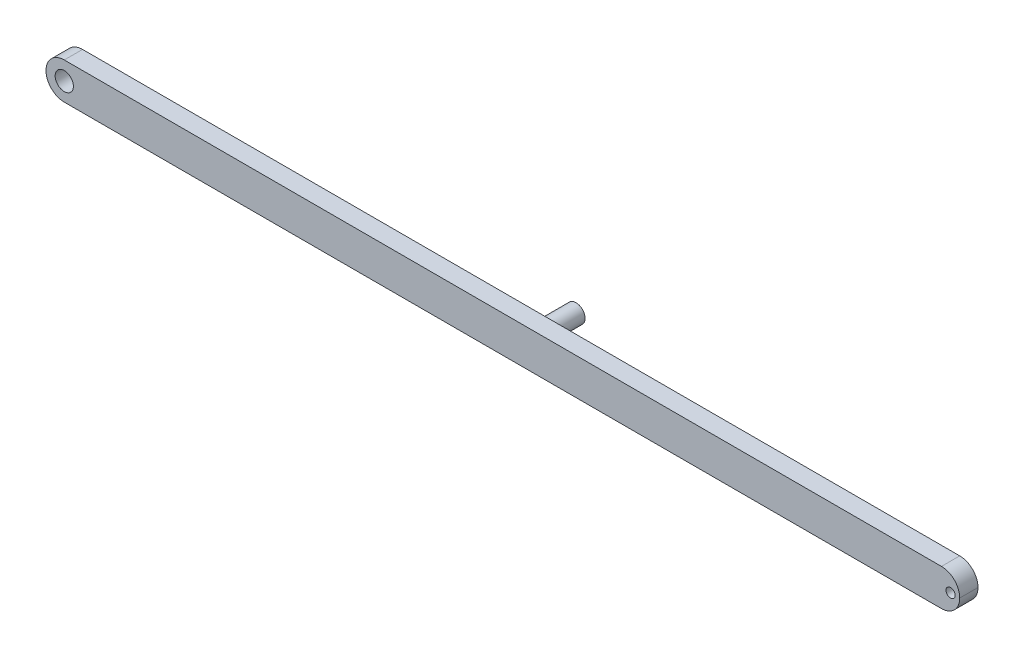
ISO-10303-21;
HEADER;
FILE_DESCRIPTION(('STEP AP214'),'2;1');
FILE_NAME('part.step','',(''),(''),'','','');
FILE_SCHEMA(('AUTOMOTIVE_DESIGN { 1 0 10303 214 1 1 1 1 }'));
ENDSEC;
DATA;
#1=APPLICATION_CONTEXT('core data for automotive mechanical design processes');
#2=APPLICATION_PROTOCOL_DEFINITION('international standard','automotive_design',2000,#1);
#3=PRODUCT_CONTEXT('',#1,'mechanical');
#4=PRODUCT('Part','Part','',(#3));
#5=PRODUCT_RELATED_PRODUCT_CATEGORY('part','',(#4));
#6=PRODUCT_DEFINITION_FORMATION('','',#4);
#7=PRODUCT_DEFINITION_CONTEXT('part definition',#1,'design');
#8=PRODUCT_DEFINITION('design','',#6,#7);
#9=PRODUCT_DEFINITION_SHAPE('','',#8);
#10=(LENGTH_UNIT() NAMED_UNIT(*) SI_UNIT(.MILLI.,.METRE.));
#11=(NAMED_UNIT(*) PLANE_ANGLE_UNIT() SI_UNIT($,.RADIAN.));
#12=(NAMED_UNIT(*) SI_UNIT($,.STERADIAN.) SOLID_ANGLE_UNIT());
#13=UNCERTAINTY_MEASURE_WITH_UNIT(LENGTH_MEASURE(1.E-05),#10,'distance_accuracy_value','');
#14=(GEOMETRIC_REPRESENTATION_CONTEXT(3) GLOBAL_UNCERTAINTY_ASSIGNED_CONTEXT((#13)) GLOBAL_UNIT_ASSIGNED_CONTEXT((#10,
#11,#12)) REPRESENTATION_CONTEXT('',''));
#15=CARTESIAN_POINT('',(0.,0.,0.));
#16=DIRECTION('',(0.,0.,1.));
#17=DIRECTION('',(1.,0.,0.));
#18=AXIS2_PLACEMENT_3D('',#15,#16,#17);
#19=CARTESIAN_POINT('',(0.,0.,0.));
#20=DIRECTION('',(0.,0.,1.));
#21=DIRECTION('',(1.,0.,0.));
#22=AXIS2_PLACEMENT_3D('',#19,#20,#21);
#23=PLANE('',#22);
#24=CARTESIAN_POINT('',(-240.,0.,0.));
#25=DIRECTION('',(0.,0.,1.));
#26=DIRECTION('',(1.,0.,0.));
#27=AXIS2_PLACEMENT_3D('',#24,#25,#26);
#28=CIRCLE('',#27,4.99999999999999);
#29=CARTESIAN_POINT('',(-235.,0.,0.));
#30=VERTEX_POINT('',#29);
#31=EDGE_CURVE('E213',#30,#30,#28,.T.);
#32=ORIENTED_EDGE('',*,*,#31,.T.);
#33=EDGE_LOOP('',(#32));
#34=FACE_BOUND('',#33,.T.);
#35=DIRECTION('',(-1.,0.,0.));
#36=VECTOR('',#35,1.);
#37=CARTESIAN_POINT('',(-250.,10.,0.));
#38=LINE('',#37,#36);
#39=CARTESIAN_POINT('',(9.99999999999999,10.,0.));
#40=VERTEX_POINT('',#39);
#41=CARTESIAN_POINT('',(-240.,10.,0.));
#42=VERTEX_POINT('',#41);
#43=EDGE_CURVE('E209',#40,#42,#38,.T.);
#44=ORIENTED_EDGE('',*,*,#43,.F.);
#45=CARTESIAN_POINT('',(9.99999999999999,0.,0.));
#46=DIRECTION('',(0.,0.,1.));
#47=DIRECTION('',(1.,0.,0.));
#48=AXIS2_PLACEMENT_3D('',#45,#46,#47);
#49=CIRCLE('',#48,10.);
#50=CARTESIAN_POINT('',(9.99999999999999,-10.,0.));
#51=VERTEX_POINT('',#50);
#52=EDGE_CURVE('E11',#40,#51,#49,.T.);
#53=ORIENTED_EDGE('',*,*,#52,.T.);
#54=DIRECTION('',(1.,0.,0.));
#55=VECTOR('',#54,1.);
#56=CARTESIAN_POINT('',(-250.,-10.,0.));
#57=LINE('',#56,#55);
#58=CARTESIAN_POINT('',(-240.,-10.,0.));
#59=VERTEX_POINT('',#58);
#60=EDGE_CURVE('E203',#59,#51,#57,.T.);
#61=ORIENTED_EDGE('',*,*,#60,.F.);
#62=CARTESIAN_POINT('',(-240.,0.,0.));
#63=DIRECTION('',(0.,0.,1.));
#64=DIRECTION('',(1.,0.,0.));
#65=AXIS2_PLACEMENT_3D('',#62,#63,#64);
#66=CIRCLE('',#65,10.);
#67=CARTESIAN_POINT('',(-250.,0.,0.));
#68=VERTEX_POINT('',#67);
#69=EDGE_CURVE('E99',#59,#68,#66,.F.);
#70=ORIENTED_EDGE('',*,*,#69,.T.);
#71=CARTESIAN_POINT('',(-240.,0.,0.));
#72=DIRECTION('',(0.,0.,1.));
#73=DIRECTION('',(1.,0.,0.));
#74=AXIS2_PLACEMENT_3D('',#71,#72,#73);
#75=CIRCLE('',#74,10.);
#76=EDGE_CURVE('E190',#68,#42,#75,.F.);
#77=ORIENTED_EDGE('',*,*,#76,.T.);
#78=EDGE_LOOP('',(#44,#53,#61,#70,#77));
#79=FACE_BOUND('',#78,.T.);
#80=ADVANCED_FACE('F33',(#34,#79),#23,.F.);
#81=CARTESIAN_POINT('',(245.,0.,0.));
#82=DIRECTION('',(0.,0.,1.));
#83=DIRECTION('',(1.,0.,0.));
#84=AXIS2_PLACEMENT_3D('',#81,#82,#83);
#85=CIRCLE('',#84,2.5);
#86=CARTESIAN_POINT('',(247.5,0.,0.));
#87=VERTEX_POINT('',#86);
#88=EDGE_CURVE('E107',#87,#87,#85,.T.);
#89=ORIENTED_EDGE('',*,*,#88,.T.);
#90=EDGE_LOOP('',(#89));
#91=FACE_BOUND('',#90,.T.);
#92=CARTESIAN_POINT('',(240.,-10.,0.));
#93=VERTEX_POINT('',#92);
#94=EDGE_CURVE('E208',#51,#93,#57,.T.);
#95=ORIENTED_EDGE('',*,*,#94,.F.);
#96=CARTESIAN_POINT('',(9.99999999999999,0.,0.));
#97=DIRECTION('',(0.,0.,1.));
#98=DIRECTION('',(1.,0.,0.));
#99=AXIS2_PLACEMENT_3D('',#96,#97,#98);
#100=CIRCLE('',#99,10.);
#101=EDGE_CURVE('E41',#51,#40,#100,.T.);
#102=ORIENTED_EDGE('',*,*,#101,.T.);
#103=CARTESIAN_POINT('',(240.,10.,0.));
#104=VERTEX_POINT('',#103);
#105=EDGE_CURVE('E96',#104,#40,#38,.T.);
#106=ORIENTED_EDGE('',*,*,#105,.F.);
#107=CARTESIAN_POINT('',(240.,0.,0.));
#108=DIRECTION('',(0.,0.,1.));
#109=DIRECTION('',(1.,0.,0.));
#110=AXIS2_PLACEMENT_3D('',#107,#108,#109);
#111=CIRCLE('',#110,10.);
#112=CARTESIAN_POINT('',(250.,0.,0.));
#113=VERTEX_POINT('',#112);
#114=EDGE_CURVE('E89',#104,#113,#111,.F.);
#115=ORIENTED_EDGE('',*,*,#114,.T.);
#116=CARTESIAN_POINT('',(240.,0.,0.));
#117=DIRECTION('',(0.,0.,1.));
#118=DIRECTION('',(1.,0.,0.));
#119=AXIS2_PLACEMENT_3D('',#116,#117,#118);
#120=CIRCLE('',#119,10.);
#121=EDGE_CURVE('E93',#113,#93,#120,.F.);
#122=ORIENTED_EDGE('',*,*,#121,.T.);
#123=EDGE_LOOP('',(#95,#102,#106,#115,#122));
#124=FACE_BOUND('',#123,.T.);
#125=ADVANCED_FACE('F91',(#91,#124),#23,.F.);
#126=CARTESIAN_POINT('',(0.,0.,10.));
#127=DIRECTION('',(0.,0.,1.));
#128=DIRECTION('',(1.,0.,0.));
#129=AXIS2_PLACEMENT_3D('',#126,#127,#128);
#130=PLANE('',#129);
#131=CARTESIAN_POINT('',(-240.,0.,10.));
#132=DIRECTION('',(0.,0.,1.));
#133=DIRECTION('',(1.,0.,0.));
#134=AXIS2_PLACEMENT_3D('',#131,#132,#133);
#135=CIRCLE('',#134,4.99999999999999);
#136=CARTESIAN_POINT('',(-235.,0.,10.));
#137=VERTEX_POINT('',#136);
#138=EDGE_CURVE('E210',#137,#137,#135,.T.);
#139=ORIENTED_EDGE('',*,*,#138,.F.);
#140=EDGE_LOOP('',(#139));
#141=FACE_BOUND('',#140,.T.);
#142=DIRECTION('',(1.,0.,0.));
#143=VECTOR('',#142,1.);
#144=CARTESIAN_POINT('',(-250.,-10.,10.));
#145=LINE('',#144,#143);
#146=CARTESIAN_POINT('',(-240.,-10.,10.));
#147=VERTEX_POINT('',#146);
#148=CARTESIAN_POINT('',(240.,-10.,10.));
#149=VERTEX_POINT('',#148);
#150=EDGE_CURVE('E196',#147,#149,#145,.T.);
#151=ORIENTED_EDGE('',*,*,#150,.T.);
#152=CARTESIAN_POINT('',(240.,0.,10.));
#153=DIRECTION('',(0.,0.,1.));
#154=DIRECTION('',(1.,0.,0.));
#155=AXIS2_PLACEMENT_3D('',#152,#153,#154);
#156=CIRCLE('',#155,10.);
#157=CARTESIAN_POINT('',(250.,0.,10.));
#158=VERTEX_POINT('',#157);
#159=EDGE_CURVE('E125',#149,#158,#156,.T.);
#160=ORIENTED_EDGE('',*,*,#159,.T.);
#161=CARTESIAN_POINT('',(240.,0.,10.));
#162=DIRECTION('',(0.,0.,1.));
#163=DIRECTION('',(1.,0.,0.));
#164=AXIS2_PLACEMENT_3D('',#161,#162,#163);
#165=CIRCLE('',#164,10.);
#166=CARTESIAN_POINT('',(240.,10.,10.));
#167=VERTEX_POINT('',#166);
#168=EDGE_CURVE('E105',#158,#167,#165,.T.);
#169=ORIENTED_EDGE('',*,*,#168,.T.);
#170=DIRECTION('',(-1.,0.,0.));
#171=VECTOR('',#170,1.);
#172=CARTESIAN_POINT('',(-250.,10.,10.));
#173=LINE('',#172,#171);
#174=CARTESIAN_POINT('',(-240.,10.,10.));
#175=VERTEX_POINT('',#174);
#176=EDGE_CURVE('E200',#167,#175,#173,.T.);
#177=ORIENTED_EDGE('',*,*,#176,.T.);
#178=CARTESIAN_POINT('',(-240.,0.,10.));
#179=DIRECTION('',(0.,0.,1.));
#180=DIRECTION('',(1.,0.,0.));
#181=AXIS2_PLACEMENT_3D('',#178,#179,#180);
#182=CIRCLE('',#181,10.);
#183=CARTESIAN_POINT('',(-250.,0.,10.));
#184=VERTEX_POINT('',#183);
#185=EDGE_CURVE('E120',#175,#184,#182,.T.);
#186=ORIENTED_EDGE('',*,*,#185,.T.);
#187=CARTESIAN_POINT('',(-240.,0.,10.));
#188=DIRECTION('',(0.,0.,1.));
#189=DIRECTION('',(1.,0.,0.));
#190=AXIS2_PLACEMENT_3D('',#187,#188,#189);
#191=CIRCLE('',#190,10.);
#192=EDGE_CURVE('E122',#184,#147,#191,.T.);
#193=ORIENTED_EDGE('',*,*,#192,.T.);
#194=EDGE_LOOP('',(#151,#160,#169,#177,#186,#193));
#195=FACE_BOUND('',#194,.T.);
#196=CARTESIAN_POINT('',(245.,0.,10.));
#197=DIRECTION('',(0.,0.,1.));
#198=DIRECTION('',(1.,0.,0.));
#199=AXIS2_PLACEMENT_3D('',#196,#197,#198);
#200=CIRCLE('',#199,2.5);
#201=CARTESIAN_POINT('',(247.5,0.,10.));
#202=VERTEX_POINT('',#201);
#203=EDGE_CURVE('E217',#202,#202,#200,.T.);
#204=ORIENTED_EDGE('',*,*,#203,.F.);
#205=EDGE_LOOP('',(#204));
#206=FACE_BOUND('',#205,.T.);
#207=ADVANCED_FACE('F155',(#141,#195,#206),#130,.T.);
#208=CARTESIAN_POINT('',(-250.,10.,10.));
#209=DIRECTION('',(0.,-1.,0.));
#210=DIRECTION('',(0.,0.,-1.));
#211=AXIS2_PLACEMENT_3D('',#208,#209,#210);
#212=PLANE('',#211);
#213=ORIENTED_EDGE('',*,*,#176,.F.);
#214=DIRECTION('',(0.,0.,-1.));
#215=VECTOR('',#214,1.);
#216=CARTESIAN_POINT('',(240.,10.,10.));
#217=LINE('',#216,#215);
#218=EDGE_CURVE('E129',#167,#104,#217,.T.);
#219=ORIENTED_EDGE('',*,*,#218,.T.);
#220=ORIENTED_EDGE('',*,*,#105,.T.);
#221=ORIENTED_EDGE('',*,*,#43,.T.);
#222=DIRECTION('',(0.,0.,-1.));
#223=VECTOR('',#222,1.);
#224=CARTESIAN_POINT('',(-240.,10.,10.));
#225=LINE('',#224,#223);
#226=EDGE_CURVE('E127',#42,#175,#225,.F.);
#227=ORIENTED_EDGE('',*,*,#226,.T.);
#228=EDGE_LOOP('',(#213,#219,#220,#221,#227));
#229=FACE_BOUND('',#228,.T.);
#230=ADVANCED_FACE('F166',(#229),#212,.F.);
#231=CARTESIAN_POINT('',(-250.,-10.,10.));
#232=DIRECTION('',(0.,1.,0.));
#233=DIRECTION('',(0.,0.,1.));
#234=AXIS2_PLACEMENT_3D('',#231,#232,#233);
#235=PLANE('',#234);
#236=ORIENTED_EDGE('',*,*,#60,.T.);
#237=ORIENTED_EDGE('',*,*,#94,.T.);
#238=DIRECTION('',(0.,0.,-1.));
#239=VECTOR('',#238,1.);
#240=CARTESIAN_POINT('',(240.,-10.,10.));
#241=LINE('',#240,#239);
#242=EDGE_CURVE('E112',#93,#149,#241,.F.);
#243=ORIENTED_EDGE('',*,*,#242,.T.);
#244=ORIENTED_EDGE('',*,*,#150,.F.);
#245=DIRECTION('',(0.,0.,-1.));
#246=VECTOR('',#245,1.);
#247=CARTESIAN_POINT('',(-240.,-10.,10.));
#248=LINE('',#247,#246);
#249=EDGE_CURVE('E113',#147,#59,#248,.T.);
#250=ORIENTED_EDGE('',*,*,#249,.T.);
#251=EDGE_LOOP('',(#236,#237,#243,#244,#250));
#252=FACE_BOUND('',#251,.T.);
#253=ADVANCED_FACE('F162',(#252),#235,.F.);
#254=CARTESIAN_POINT('',(-240.,0.,10.));
#255=DIRECTION('',(0.,0.,-1.));
#256=DIRECTION('',(-1.,0.,0.));
#257=AXIS2_PLACEMENT_3D('',#254,#255,#256);
#258=CYLINDRICAL_SURFACE('',#257,4.99999999999999);
#259=ORIENTED_EDGE('',*,*,#138,.T.);
#260=EDGE_LOOP('',(#259));
#261=FACE_BOUND('',#260,.T.);
#262=ORIENTED_EDGE('',*,*,#31,.F.);
#263=EDGE_LOOP('',(#262));
#264=FACE_BOUND('',#263,.T.);
#265=ADVANCED_FACE('F165',(#261,#264),#258,.F.);
#266=CARTESIAN_POINT('',(245.,0.,10.));
#267=DIRECTION('',(0.,0.,-1.));
#268=DIRECTION('',(-1.,0.,0.));
#269=AXIS2_PLACEMENT_3D('',#266,#267,#268);
#270=CYLINDRICAL_SURFACE('',#269,2.5);
#271=ORIENTED_EDGE('',*,*,#203,.T.);
#272=EDGE_LOOP('',(#271));
#273=FACE_BOUND('',#272,.T.);
#274=ORIENTED_EDGE('',*,*,#88,.F.);
#275=EDGE_LOOP('',(#274));
#276=FACE_BOUND('',#275,.T.);
#277=ADVANCED_FACE('F176',(#273,#276),#270,.F.);
#278=CARTESIAN_POINT('',(240.,0.,10.));
#279=DIRECTION('',(0.,0.,-1.));
#280=DIRECTION('',(-1.,0.,0.));
#281=AXIS2_PLACEMENT_3D('',#278,#279,#280);
#282=CYLINDRICAL_SURFACE('',#281,10.);
#283=ORIENTED_EDGE('',*,*,#218,.F.);
#284=ORIENTED_EDGE('',*,*,#168,.F.);
#285=DIRECTION('',(0.,0.,-1.));
#286=VECTOR('',#285,1.);
#287=CARTESIAN_POINT('',(250.,0.,10.));
#288=LINE('',#287,#286);
#289=EDGE_CURVE('E103',#113,#158,#288,.F.);
#290=ORIENTED_EDGE('',*,*,#289,.F.);
#291=ORIENTED_EDGE('',*,*,#114,.F.);
#292=EDGE_LOOP('',(#283,#284,#290,#291));
#293=FACE_BOUND('',#292,.T.);
#294=ADVANCED_FACE('F104',(#293),#282,.T.);
#295=CARTESIAN_POINT('',(240.,0.,10.));
#296=DIRECTION('',(0.,0.,-1.));
#297=DIRECTION('',(-1.,0.,0.));
#298=AXIS2_PLACEMENT_3D('',#295,#296,#297);
#299=CYLINDRICAL_SURFACE('',#298,10.);
#300=ORIENTED_EDGE('',*,*,#159,.F.);
#301=ORIENTED_EDGE('',*,*,#242,.F.);
#302=ORIENTED_EDGE('',*,*,#121,.F.);
#303=ORIENTED_EDGE('',*,*,#289,.T.);
#304=EDGE_LOOP('',(#300,#301,#302,#303));
#305=FACE_BOUND('',#304,.T.);
#306=ADVANCED_FACE('F110',(#305),#299,.T.);
#307=CARTESIAN_POINT('',(-240.,0.,10.));
#308=DIRECTION('',(0.,0.,-1.));
#309=DIRECTION('',(-1.,0.,0.));
#310=AXIS2_PLACEMENT_3D('',#307,#308,#309);
#311=CYLINDRICAL_SURFACE('',#310,10.);
#312=DIRECTION('',(0.,0.,-1.));
#313=VECTOR('',#312,1.);
#314=CARTESIAN_POINT('',(-250.,0.,10.));
#315=LINE('',#314,#313);
#316=EDGE_CURVE('E108',#184,#68,#315,.T.);
#317=ORIENTED_EDGE('',*,*,#316,.F.);
#318=ORIENTED_EDGE('',*,*,#185,.F.);
#319=ORIENTED_EDGE('',*,*,#226,.F.);
#320=ORIENTED_EDGE('',*,*,#76,.F.);
#321=EDGE_LOOP('',(#317,#318,#319,#320));
#322=FACE_BOUND('',#321,.T.);
#323=ADVANCED_FACE('F173',(#322),#311,.T.);
#324=CARTESIAN_POINT('',(-240.,0.,10.));
#325=DIRECTION('',(0.,0.,-1.));
#326=DIRECTION('',(-1.,0.,0.));
#327=AXIS2_PLACEMENT_3D('',#324,#325,#326);
#328=CYLINDRICAL_SURFACE('',#327,10.);
#329=ORIENTED_EDGE('',*,*,#192,.F.);
#330=ORIENTED_EDGE('',*,*,#316,.T.);
#331=ORIENTED_EDGE('',*,*,#69,.F.);
#332=ORIENTED_EDGE('',*,*,#249,.F.);
#333=EDGE_LOOP('',(#329,#330,#331,#332));
#334=FACE_BOUND('',#333,.T.);
#335=ADVANCED_FACE('F177',(#334),#328,.T.);
#336=CARTESIAN_POINT('',(9.99999999999999,0.,-20.));
#337=DIRECTION('',(0.,0.,1.));
#338=DIRECTION('',(1.,0.,0.));
#339=AXIS2_PLACEMENT_3D('',#336,#337,#338);
#340=CYLINDRICAL_SURFACE('',#339,5.);
#341=CARTESIAN_POINT('',(9.99999999999999,0.,-5.));
#342=DIRECTION('',(0.,0.,1.));
#343=DIRECTION('',(1.,0.,0.));
#344=AXIS2_PLACEMENT_3D('',#341,#342,#343);
#345=CIRCLE('',#344,5.);
#346=CARTESIAN_POINT('',(15.,0.,-5.));
#347=VERTEX_POINT('',#346);
#348=EDGE_CURVE('E130',#347,#347,#345,.F.);
#349=ORIENTED_EDGE('',*,*,#348,.T.);
#350=EDGE_LOOP('',(#349));
#351=FACE_BOUND('',#350,.T.);
#352=CARTESIAN_POINT('',(9.99999999999999,0.,-20.));
#353=DIRECTION('',(0.,0.,-1.));
#354=DIRECTION('',(-1.,0.,0.));
#355=AXIS2_PLACEMENT_3D('',#352,#353,#354);
#356=CIRCLE('',#355,5.);
#357=CARTESIAN_POINT('',(4.99999999999999,0.,-20.));
#358=VERTEX_POINT('',#357);
#359=EDGE_CURVE('E134',#358,#358,#356,.T.);
#360=ORIENTED_EDGE('',*,*,#359,.F.);
#361=EDGE_LOOP('',(#360));
#362=FACE_BOUND('',#361,.T.);
#363=ADVANCED_FACE('F138',(#351,#362),#340,.T.);
#364=CARTESIAN_POINT('',(9.99999999999999,0.,-20.));
#365=DIRECTION('',(0.,0.,-1.));
#366=DIRECTION('',(-1.,0.,0.));
#367=AXIS2_PLACEMENT_3D('',#364,#365,#366);
#368=PLANE('',#367);
#369=ORIENTED_EDGE('',*,*,#359,.T.);
#370=EDGE_LOOP('',(#369));
#371=FACE_BOUND('',#370,.T.);
#372=ADVANCED_FACE('F142',(#371),#368,.T.);
#373=CARTESIAN_POINT('',(9.99999999999999,0.,-5.));
#374=DIRECTION('',(0.,0.,1.));
#375=DIRECTION('',(1.,0.,0.));
#376=AXIS2_PLACEMENT_3D('',#373,#374,#375);
#377=TOROIDAL_SURFACE('',#376,10.,5.);
#378=ORIENTED_EDGE('',*,*,#101,.F.);
#379=ORIENTED_EDGE('',*,*,#52,.F.);
#380=EDGE_LOOP('',(#378,#379));
#381=FACE_BOUND('',#380,.T.);
#382=ORIENTED_EDGE('',*,*,#348,.F.);
#383=EDGE_LOOP('',(#382));
#384=FACE_BOUND('',#383,.T.);
#385=ADVANCED_FACE('F35',(#381,#384),#377,.F.);
#386=CLOSED_SHELL('',(#80,#125,#207,#230,#253,#265,#277,#294,#306,#323,#335,#363,#372,#385));
#387=MANIFOLD_SOLID_BREP('B2',#386);
#388=ADVANCED_BREP_SHAPE_REPRESENTATION('',(#18,#387),#14);
#389=SHAPE_DEFINITION_REPRESENTATION(#9,#388);
ENDSEC;
END-ISO-10303-21;
